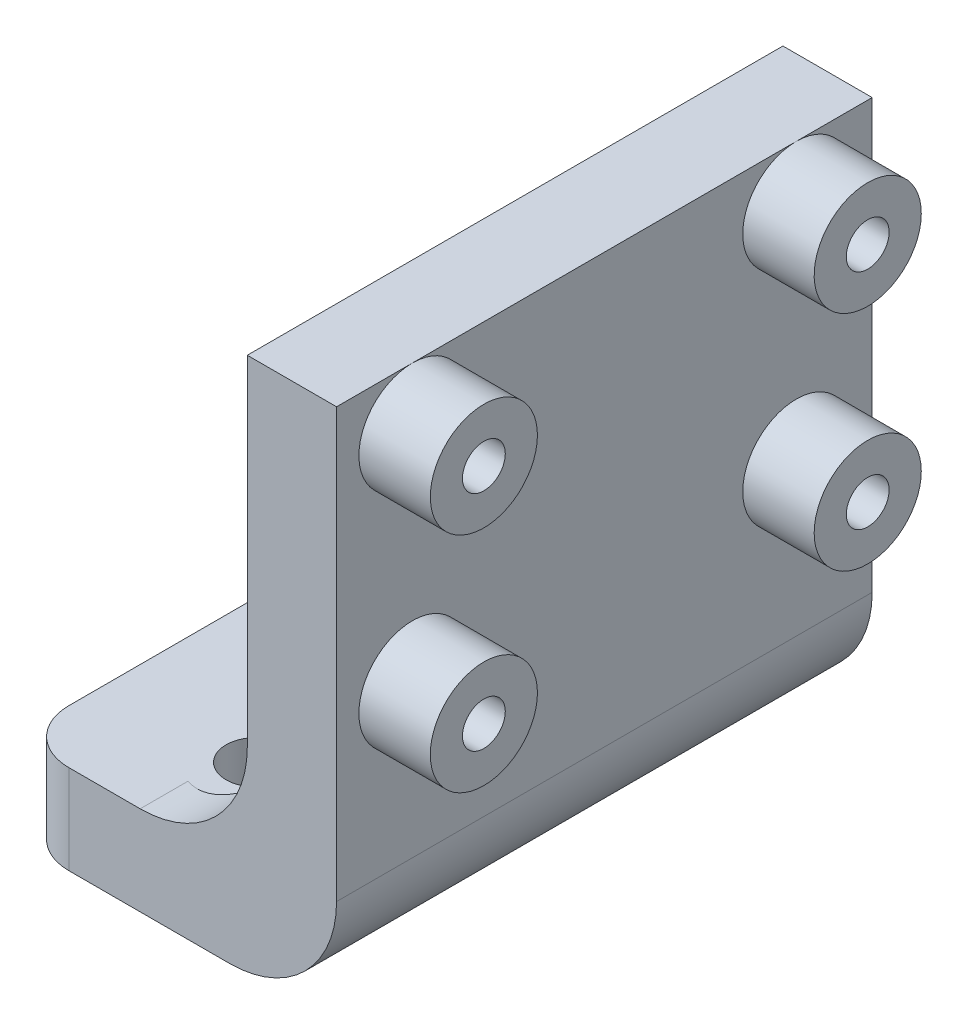
ISO-10303-21;
HEADER;
FILE_DESCRIPTION(('STEP AP214'),'2;1');
FILE_NAME('part.step','',(''),(''),'','','');
FILE_SCHEMA(('AUTOMOTIVE_DESIGN { 1 0 10303 214 1 1 1 1 }'));
ENDSEC;
DATA;
#1=APPLICATION_CONTEXT('core data for automotive mechanical design processes');
#2=APPLICATION_PROTOCOL_DEFINITION('international standard','automotive_design',2000,#1);
#3=PRODUCT_CONTEXT('',#1,'mechanical');
#4=PRODUCT('Part','Part','',(#3));
#5=PRODUCT_RELATED_PRODUCT_CATEGORY('part','',(#4));
#6=PRODUCT_DEFINITION_FORMATION('','',#4);
#7=PRODUCT_DEFINITION_CONTEXT('part definition',#1,'design');
#8=PRODUCT_DEFINITION('design','',#6,#7);
#9=PRODUCT_DEFINITION_SHAPE('','',#8);
#10=(LENGTH_UNIT() NAMED_UNIT(*) SI_UNIT(.MILLI.,.METRE.));
#11=(NAMED_UNIT(*) PLANE_ANGLE_UNIT() SI_UNIT($,.RADIAN.));
#12=(NAMED_UNIT(*) SI_UNIT($,.STERADIAN.) SOLID_ANGLE_UNIT());
#13=UNCERTAINTY_MEASURE_WITH_UNIT(LENGTH_MEASURE(1.E-05),#10,'distance_accuracy_value','');
#14=(GEOMETRIC_REPRESENTATION_CONTEXT(3) GLOBAL_UNCERTAINTY_ASSIGNED_CONTEXT((#13)) GLOBAL_UNIT_ASSIGNED_CONTEXT((#10,
#11,#12)) REPRESENTATION_CONTEXT('',''));
#15=CARTESIAN_POINT('',(0.,0.,0.));
#16=DIRECTION('',(0.,0.,1.));
#17=DIRECTION('',(1.,0.,0.));
#18=AXIS2_PLACEMENT_3D('',#15,#16,#17);
#19=CARTESIAN_POINT('',(7.,11.,0.));
#20=DIRECTION('',(0.,0.,-1.));
#21=DIRECTION('',(-1.,0.,0.));
#22=AXIS2_PLACEMENT_3D('',#19,#20,#21);
#23=CYLINDRICAL_SURFACE('',#22,6.);
#24=CARTESIAN_POINT('',(8.00000000000002,5.08392021690039,-28.5100714985278));
#25=CARTESIAN_POINT('',(7.84789751883135,5.0582090319891,-28.5100718905972));
#26=CARTESIAN_POINT('',(7.69478669028184,5.03841290223535,-28.4984583774313));
#27=CARTESIAN_POINT('',(7.39109321818378,5.010818719596,-28.4516411505789));
#28=CARTESIAN_POINT('',(7.24051068436831,5.00302118614912,-28.4164364156849));
#29=CARTESIAN_POINT('',(6.94662113330718,4.9984380002323,-28.3232790272564));
#30=CARTESIAN_POINT('',(6.80330544942507,5.00163890158644,-28.2653542269523));
#31=CARTESIAN_POINT('',(6.52765165009657,5.01702638052834,-28.1284476730564));
#32=CARTESIAN_POINT('',(6.39531651588847,5.02921538957966,-28.0494602252875));
#33=CARTESIAN_POINT('',(6.14157484736655,5.06031340202125,-27.8703658466389));
#34=CARTESIAN_POINT('',(6.02053405636214,5.07938618866492,-27.7697707517315));
#35=CARTESIAN_POINT('',(5.79589944101414,5.120951216748,-27.5512757937397));
#36=CARTESIAN_POINT('',(5.6923122060305,5.14344474357238,-27.4333694263107));
#37=CARTESIAN_POINT('',(5.49794879192282,5.19013258645659,-27.1737691895386));
#38=CARTESIAN_POINT('',(5.4086435980823,5.21433210681904,-27.0309710247807));
#39=CARTESIAN_POINT('',(5.25495778141584,5.25881037495424,-26.7319533641095));
#40=CARTESIAN_POINT('',(5.19057661223977,5.279089208666,-26.5757341624854));
#41=CARTESIAN_POINT('',(5.08862686331395,5.31233184985612,-26.2534105787782));
#42=CARTESIAN_POINT('',(5.05114665618848,5.32527151843515,-26.0872755403016));
#43=CARTESIAN_POINT('',(5.00484182259961,5.34138064893803,-25.7506247909624));
#44=CARTESIAN_POINT('',(4.99600444669539,5.34455445779034,-25.5801110632094));
#45=CARTESIAN_POINT('',(5.00702185375319,5.34066741066939,-25.2492791766949));
#46=CARTESIAN_POINT('',(5.02537249194092,5.33414303116793,-25.0889019929779));
#47=CARTESIAN_POINT('',(5.08734945130609,5.31292477909426,-24.7736758505269));
#48=CARTESIAN_POINT('',(5.13097943444225,5.29822972293261,-24.6188276961774));
#49=CARTESIAN_POINT('',(5.24232027935767,5.26293096284372,-24.3179899429784));
#50=CARTESIAN_POINT('',(5.31014095300742,5.24230039909582,-24.1720443540208));
#51=CARTESIAN_POINT('',(5.46797419439544,5.19831129596387,-23.8931166470157));
#52=CARTESIAN_POINT('',(5.55799442724695,5.17495181580273,-23.7601390287553));
#53=CARTESIAN_POINT('',(5.76359835659601,5.12777655893467,-23.5033325186111));
#54=CARTESIAN_POINT('',(5.88030325370111,5.10400468687349,-23.3803902889661));
#55=CARTESIAN_POINT('',(6.13328376796262,5.06154714335134,-23.1555012022659));
#56=CARTESIAN_POINT('',(6.26955830164238,5.0428611904732,-23.0535531836223));
#57=CARTESIAN_POINT('',(6.55672864211378,5.01467674324886,-22.8746797145725));
#58=CARTESIAN_POINT('',(6.70747012003499,5.00509105208329,-22.7975215641654));
#59=CARTESIAN_POINT('',(7.02001396713849,4.99800371360368,-22.6696338153028));
#60=CARTESIAN_POINT('',(7.18180892005238,5.00049404094881,-22.6188866897412));
#61=CARTESIAN_POINT('',(7.4986470350424,5.01880796232367,-22.5481412922416));
#62=CARTESIAN_POINT('',(7.65330554464378,5.03363261688468,-22.5261478023029));
#63=CARTESIAN_POINT('',(7.96246543819703,5.07564477542519,-22.5063104948437));
#64=CARTESIAN_POINT('',(8.1169668319394,5.1028314548921,-22.5084650669414));
#65=CARTESIAN_POINT('',(8.4180947427373,5.16799668978171,-22.5355823302101));
#66=CARTESIAN_POINT('',(8.56481875026833,5.20573439901383,-22.5600608283495));
#67=CARTESIAN_POINT('',(8.85049608936739,5.29054339647473,-22.6293974820097));
#68=CARTESIAN_POINT('',(8.98944769828473,5.33761674339956,-22.6742601354694));
#69=CARTESIAN_POINT('',(9.26869878913494,5.44327722875373,-22.7870223344731));
#70=CARTESIAN_POINT('',(9.4080849777656,5.50250662943537,-22.856572283433));
#71=CARTESIAN_POINT('',(9.67287558726987,5.62625425950321,-23.0150095501323));
#72=CARTESIAN_POINT('',(9.79826743781556,5.69077715491286,-23.1039140448409));
#73=CARTESIAN_POINT('',(10.0499147727355,5.83071591538383,-23.3127575212907));
#74=CARTESIAN_POINT('',(10.1738731439714,5.90640040284554,-23.4352915406591));
#75=CARTESIAN_POINT('',(10.3996776472082,6.05425549512645,-23.7012148664911));
#76=CARTESIAN_POINT('',(10.5015261917709,6.12642648266147,-23.8446018946791));
#77=CARTESIAN_POINT('',(10.6631941942347,6.24719201144914,-24.1215587351886));
#78=CARTESIAN_POINT('',(10.7273245709457,6.2976581659982,-24.2517883733249));
#79=CARTESIAN_POINT('',(10.8369542441046,6.38667299424251,-24.5236271236072));
#80=CARTESIAN_POINT('',(10.88248706868,6.42524308343137,-24.6652152019735));
#81=CARTESIAN_POINT('',(10.9470009130155,6.48084897615273,-24.9345027153276));
#82=CARTESIAN_POINT('',(10.9689953033555,6.5002896056914,-25.0609729892381));
#83=CARTESIAN_POINT('',(10.9965453595324,6.52473619305721,-25.3170449017964));
#84=CARTESIAN_POINT('',(11.0021140281965,6.52975356845063,-25.4466439816513));
#85=CARTESIAN_POINT('',(10.9964403595016,6.52468173703199,-25.7052004271848));
#86=CARTESIAN_POINT('',(10.9851929579425,6.51458797946458,-25.8341575878121));
#87=CARTESIAN_POINT('',(10.9466440770006,6.48063766484156,-26.0878221345364));
#88=CARTESIAN_POINT('',(10.9193249506222,6.45676597996047,-26.2125246895265));
#89=CARTESIAN_POINT('',(10.8413630375012,6.39053808606457,-26.4855584185128));
#90=CARTESIAN_POINT('',(10.7865795709987,6.3450410814341,-26.6319331290956));
#91=CARTESIAN_POINT('',(10.657149869379,6.24268544349807,-26.9112655548037));
#92=CARTESIAN_POINT('',(10.5824770782626,6.18581164549419,-27.0442050015274));
#93=CARTESIAN_POINT('',(10.4142179546171,6.06502113584838,-27.2975407235344));
#94=CARTESIAN_POINT('',(10.320338678796,6.00100332347775,-27.4176926080188));
#95=CARTESIAN_POINT('',(10.1161227293644,5.87121485857937,-27.6419813245769));
#96=CARTESIAN_POINT('',(10.0057813494506,5.80544370922598,-27.7461135594911));
#97=CARTESIAN_POINT('',(9.74667985326442,5.66318036839258,-27.955901081222));
#98=CARTESIAN_POINT('',(9.59463100724248,5.58712113453784,-28.057834684635));
#99=CARTESIAN_POINT('',(9.27131846231304,5.44371591313926,-28.2335827090987));
#100=CARTESIAN_POINT('',(9.10006810367525,5.37636394539931,-28.3074164977263));
#101=CARTESIAN_POINT('',(8.7754129689379,5.26661901894525,-28.4121795980406));
#102=CARTESIAN_POINT('',(8.6245305388454,5.2219138419297,-28.4485064269848));
#103=CARTESIAN_POINT('',(8.31612682654759,5.14397534596778,-28.497441478707));
#104=CARTESIAN_POINT('',(8.15861166223169,5.11073170442769,-28.5100710896798));
#105=CARTESIAN_POINT('',(8.00000000000002,5.08392021690039,-28.5100714985278));
#106=B_SPLINE_CURVE_WITH_KNOTS('',3,(#24,#25,#26,#27,#28,#29,#30,#31,#32,#33,#34,#35,#36,#37,
#38,#39,#40,#41,#42,#43,#44,#45,#46,#47,#48,#49,#50,#51,#52,#53,#54,#55,#56,#57,#58,#59,#60,#61,
#62,#63,#64,#65,#66,#67,#68,#69,#70,#71,#72,#73,#74,#75,#76,#77,#78,#79,#80,#81,#82,#83,#84,#85,
#86,#87,#88,#89,#90,#91,#92,#93,#94,#95,#96,#97,#98,#99,#100,#101,#102,#103,#104,#105),
.UNSPECIFIED.,.T.,.F.,(4,2,2,2,2,2,2,2,2,2,2,2,2,2,2,2,2,2,2,2,2,2,2,2,2,2,2,2,2,2,2,2,2,2,2,2,
2,2,2,2,4),(0.,0.462216772276608,0.924453554105707,1.38612542786928,1.84792223898085,
2.32152132255117,2.79529880850828,3.30338605339703,3.81146216006648,4.32119980685944,
4.83071052904856,5.3130650876817,5.79548953753474,6.2801323868527,6.76494280960626,
7.2760332675764,7.78709543982784,8.2932097693966,8.79898779746674,9.26738842836665,
9.73575782283287,10.1942040743756,10.652751535185,11.1507650580638,11.6492223780737,
12.2168840199377,12.784483688999,13.243869500551,13.7024234250507,14.0902043220262,
14.477678163818,14.8652687177982,15.2532856484527,15.7390013161089,16.225368785285,
16.7197967965541,17.2143664302404,17.8061212966767,18.3974675588638,18.8799003974332,
19.3618976008901),.UNSPECIFIED.);
#107=CARTESIAN_POINT('',(6.99999999999999,5.,-22.6816443737816));
#108=VERTEX_POINT('',#107);
#109=CARTESIAN_POINT('',(6.99999999999999,5.,-28.338498623274));
#110=VERTEX_POINT('',#109);
#111=EDGE_CURVE('E151',#108,#110,#106,.T.);
#112=ORIENTED_EDGE('',*,*,#111,.F.);
#113=DIRECTION('',(0.,0.,-1.));
#114=VECTOR('',#113,1.);
#115=CARTESIAN_POINT('',(7.,5.,0.));
#116=LINE('',#115,#114);
#117=CARTESIAN_POINT('',(7.,5.,-8.33849862327395));
#118=VERTEX_POINT('',#117);
#119=EDGE_CURVE('E159',#118,#108,#116,.T.);
#120=ORIENTED_EDGE('',*,*,#119,.F.);
#121=CARTESIAN_POINT('',(8.00000000000004,5.08392021690039,-8.51007149852777));
#122=CARTESIAN_POINT('',(7.84789751883137,5.0582090319891,-8.51007189059724));
#123=CARTESIAN_POINT('',(7.69478669028186,5.03841290223536,-8.49845837743126));
#124=CARTESIAN_POINT('',(7.39109321818379,5.010818719596,-8.45164115057889));
#125=CARTESIAN_POINT('',(7.24051068436833,5.00302118614912,-8.41643641568487));
#126=CARTESIAN_POINT('',(6.94662113330719,4.9984380002323,-8.32327902725642));
#127=CARTESIAN_POINT('',(6.80330544942508,5.00163890158644,-8.26535422695225));
#128=CARTESIAN_POINT('',(6.52765165009659,5.01702638052834,-8.12844767305636));
#129=CARTESIAN_POINT('',(6.39531651588848,5.02921538957966,-8.04946022528747));
#130=CARTESIAN_POINT('',(6.14157484736656,5.06031340202125,-7.87036584663891));
#131=CARTESIAN_POINT('',(6.02053405636215,5.07938618866492,-7.76977075173145));
#132=CARTESIAN_POINT('',(5.79589944101416,5.120951216748,-7.55127579373965));
#133=CARTESIAN_POINT('',(5.69231220603051,5.14344474357238,-7.43336942631073));
#134=CARTESIAN_POINT('',(5.49794879192283,5.19013258645658,-7.17376918953857));
#135=CARTESIAN_POINT('',(5.40864359808231,5.21433210681904,-7.03097102478068));
#136=CARTESIAN_POINT('',(5.25495778141585,5.25881037495424,-6.73195336410947));
#137=CARTESIAN_POINT('',(5.19057661223979,5.279089208666,-6.57573416248538));
#138=CARTESIAN_POINT('',(5.08862686331396,5.31233184985611,-6.25341057877823));
#139=CARTESIAN_POINT('',(5.05114665618849,5.32527151843515,-6.08727554030163));
#140=CARTESIAN_POINT('',(5.00484182259962,5.34138064893803,-5.75062479096235));
#141=CARTESIAN_POINT('',(4.9960044466954,5.34455445779033,-5.58011106320936));
#142=CARTESIAN_POINT('',(5.00702185375321,5.34066741066938,-5.24927917669486));
#143=CARTESIAN_POINT('',(5.02537249194093,5.33414303116792,-5.08890199297787));
#144=CARTESIAN_POINT('',(5.0873494513061,5.31292477909426,-4.7736758505269));
#145=CARTESIAN_POINT('',(5.13097943444227,5.29822972293261,-4.61882769617738));
#146=CARTESIAN_POINT('',(5.24232027935769,5.26293096284372,-4.3179899429784));
#147=CARTESIAN_POINT('',(5.31014095300743,5.24230039909582,-4.17204435402083));
#148=CARTESIAN_POINT('',(5.46797419439546,5.19831129596387,-3.8931166470157));
#149=CARTESIAN_POINT('',(5.55799442724697,5.17495181580272,-3.76013902875524));
#150=CARTESIAN_POINT('',(5.76359835659603,5.12777655893467,-3.50333251861106));
#151=CARTESIAN_POINT('',(5.88030325370113,5.10400468687349,-3.3803902889661));
#152=CARTESIAN_POINT('',(6.13328376796264,5.06154714335134,-3.15550120226593));
#153=CARTESIAN_POINT('',(6.2695583016424,5.0428611904732,-3.05355318362233));
#154=CARTESIAN_POINT('',(6.55672864211379,5.01467674324886,-2.87467971457246));
#155=CARTESIAN_POINT('',(6.707470120035,5.00509105208329,-2.7975215641654));
#156=CARTESIAN_POINT('',(7.0200139671385,4.99800371360368,-2.66963381530275));
#157=CARTESIAN_POINT('',(7.1818089200524,5.00049404094881,-2.61888668974117));
#158=CARTESIAN_POINT('',(7.49864703504242,5.01880796232367,-2.54814129224155));
#159=CARTESIAN_POINT('',(7.6533055446438,5.03363261688468,-2.5261478023029));
#160=CARTESIAN_POINT('',(7.96246543819704,5.07564477542519,-2.50631049484368));
#161=CARTESIAN_POINT('',(8.11696683193941,5.10283145489211,-2.50846506694137));
#162=CARTESIAN_POINT('',(8.41809474273732,5.16799668978171,-2.53558233021011));
#163=CARTESIAN_POINT('',(8.56481875026835,5.20573439901384,-2.56006082834954));
#164=CARTESIAN_POINT('',(8.85049608936741,5.29054339647474,-2.62939748200974));
#165=CARTESIAN_POINT('',(8.98944769828475,5.33761674339957,-2.67426013546944));
#166=CARTESIAN_POINT('',(9.26869878913496,5.44327722875373,-2.78702233447305));
#167=CARTESIAN_POINT('',(9.40808497776562,5.50250662943538,-2.85657228343301));
#168=CARTESIAN_POINT('',(9.67287558726989,5.62625425950321,-3.01500955013231));
#169=CARTESIAN_POINT('',(9.79826743781558,5.69077715491287,-3.1039140448409));
#170=CARTESIAN_POINT('',(10.0499147727355,5.83071591538383,-3.31275752129071));
#171=CARTESIAN_POINT('',(10.1738731439714,5.90640040284555,-3.43529154065911));
#172=CARTESIAN_POINT('',(10.3996776472082,6.05425549512645,-3.70121486649106));
#173=CARTESIAN_POINT('',(10.501526191771,6.12642648266148,-3.84460189467909));
#174=CARTESIAN_POINT('',(10.6631941942347,6.24719201144915,-4.12155873518855));
#175=CARTESIAN_POINT('',(10.7273245709457,6.29765816599821,-4.2517883733249));
#176=CARTESIAN_POINT('',(10.8369542441047,6.38667299424253,-4.52362712360718));
#177=CARTESIAN_POINT('',(10.88248706868,6.42524308343138,-4.66521520197349));
#178=CARTESIAN_POINT('',(10.9470009130155,6.48084897615274,-4.93450271532765));
#179=CARTESIAN_POINT('',(10.9689953033555,6.50028960569141,-5.06097298923808));
#180=CARTESIAN_POINT('',(10.9965453595324,6.52473619305722,-5.31704490179642));
#181=CARTESIAN_POINT('',(11.0021140281965,6.52975356845064,-5.44664398165132));
#182=CARTESIAN_POINT('',(10.9964403595016,6.524681737032,-5.70520042718476));
#183=CARTESIAN_POINT('',(10.9851929579425,6.51458797946459,-5.83415758781215));
#184=CARTESIAN_POINT('',(10.9466440770006,6.48063766484157,-6.08782213453639));
#185=CARTESIAN_POINT('',(10.9193249506223,6.45676597996048,-6.21252468952653));
#186=CARTESIAN_POINT('',(10.8413630375012,6.39053808606457,-6.48555841851276));
#187=CARTESIAN_POINT('',(10.7865795709987,6.34504108143411,-6.6319331290956));
#188=CARTESIAN_POINT('',(10.657149869379,6.24268544349808,-6.91126555480372));
#189=CARTESIAN_POINT('',(10.5824770782627,6.18581164549419,-7.04420500152737));
#190=CARTESIAN_POINT('',(10.4142179546171,6.06502113584838,-7.29754072353443));
#191=CARTESIAN_POINT('',(10.320338678796,6.00100332347775,-7.41769260801878));
#192=CARTESIAN_POINT('',(10.1161227293644,5.87121485857937,-7.64198132457693));
#193=CARTESIAN_POINT('',(10.0057813494506,5.80544370922598,-7.74611355949108));
#194=CARTESIAN_POINT('',(9.74667985326442,5.66318036839258,-7.95590108122199));
#195=CARTESIAN_POINT('',(9.59463100724249,5.58712113453784,-8.05783468463498));
#196=CARTESIAN_POINT('',(9.27131846231304,5.44371591313925,-8.23358270909868));
#197=CARTESIAN_POINT('',(9.10006810367526,5.37636394539931,-8.30741649772632));
#198=CARTESIAN_POINT('',(8.77541296893791,5.26661901894525,-8.41217959804061));
#199=CARTESIAN_POINT('',(8.62453053884541,5.2219138419297,-8.44850642698478));
#200=CARTESIAN_POINT('',(8.3161268265476,5.14397534596778,-8.49744147870698));
#201=CARTESIAN_POINT('',(8.1586116622317,5.11073170442769,-8.51007108967981));
#202=CARTESIAN_POINT('',(8.00000000000004,5.08392021690039,-8.51007149852777));
#203=B_SPLINE_CURVE_WITH_KNOTS('',3,(#121,#122,#123,#124,#125,#126,#127,#128,#129,#130,#131,
#132,#133,#134,#135,#136,#137,#138,#139,#140,#141,#142,#143,#144,#145,#146,#147,#148,#149,#150,
#151,#152,#153,#154,#155,#156,#157,#158,#159,#160,#161,#162,#163,#164,#165,#166,#167,#168,#169,
#170,#171,#172,#173,#174,#175,#176,#177,#178,#179,#180,#181,#182,#183,#184,#185,#186,#187,#188,
#189,#190,#191,#192,#193,#194,#195,#196,#197,#198,#199,#200,#201,#202),.UNSPECIFIED.,.T.,.F.,(4,
2,2,2,2,2,2,2,2,2,2,2,2,2,2,2,2,2,2,2,2,2,2,2,2,2,2,2,2,2,2,2,2,2,2,2,2,2,2,2,4),(0.,
0.462216772276608,0.924453554105709,1.38612542786929,1.84792223898085,2.32152132255117,
2.79529880850828,3.30338605339703,3.81146216006649,4.32119980685945,4.83071052904856,
5.31306508768171,5.79548953753475,6.28013238685271,6.76494280960627,7.27603326757641,
7.78709543982784,8.29320976939661,8.79898779746675,9.26738842836666,9.73575782283288,
10.1942040743756,10.652751535185,11.1507650580638,11.6492223780738,12.2168840199377,
12.784483688999,13.243869500551,13.7024234250507,14.0902043220263,14.477678163818,
14.8652687177983,15.2532856484527,15.7390013161089,16.225368785285,16.7197967965541,
17.2143664302404,17.8061212966767,18.3974675588638,18.8799003974332,19.3618976008901),.UNSPECIFIED.);
#204=CARTESIAN_POINT('',(7.,5.,-2.68164437378159));
#205=VERTEX_POINT('',#204);
#206=EDGE_CURVE('E142',#205,#118,#203,.T.);
#207=ORIENTED_EDGE('',*,*,#206,.F.);
#208=CARTESIAN_POINT('',(7.,5.,0.));
#209=VERTEX_POINT('',#208);
#210=EDGE_CURVE('E160',#209,#205,#116,.T.);
#211=ORIENTED_EDGE('',*,*,#210,.F.);
#212=CARTESIAN_POINT('',(7.,11.,0.));
#213=DIRECTION('',(0.,0.,-1.));
#214=DIRECTION('',(-1.,0.,0.));
#215=AXIS2_PLACEMENT_3D('',#212,#213,#214);
#216=CIRCLE('',#215,6.);
#217=CARTESIAN_POINT('',(13.,11.,0.));
#218=VERTEX_POINT('',#217);
#219=EDGE_CURVE('E181',#218,#209,#216,.T.);
#220=ORIENTED_EDGE('',*,*,#219,.F.);
#221=DIRECTION('',(0.,0.,-1.));
#222=VECTOR('',#221,1.);
#223=CARTESIAN_POINT('',(13.,11.,0.));
#224=LINE('',#223,#222);
#225=CARTESIAN_POINT('',(13.,11.,-30.));
#226=VERTEX_POINT('',#225);
#227=EDGE_CURVE('E171',#226,#218,#224,.F.);
#228=ORIENTED_EDGE('',*,*,#227,.F.);
#229=CARTESIAN_POINT('',(6.99999999999999,11.,-30.));
#230=DIRECTION('',(0.,0.,1.));
#231=DIRECTION('',(1.,0.,0.));
#232=AXIS2_PLACEMENT_3D('',#229,#230,#231);
#233=CIRCLE('',#232,6.);
#234=CARTESIAN_POINT('',(6.99999999999999,5.,-30.));
#235=VERTEX_POINT('',#234);
#236=EDGE_CURVE('E178',#235,#226,#233,.T.);
#237=ORIENTED_EDGE('',*,*,#236,.F.);
#238=EDGE_CURVE('E167',#110,#235,#116,.T.);
#239=ORIENTED_EDGE('',*,*,#238,.F.);
#240=EDGE_LOOP('',(#112,#120,#207,#211,#220,#228,#237,#239));
#241=FACE_BOUND('',#240,.T.);
#242=ADVANCED_FACE('F45',(#241),#23,.F.);
#243=CARTESIAN_POINT('',(8.00000000000002,24.,-25.5100714985278));
#244=DIRECTION('',(0.,-1.,0.));
#245=DIRECTION('',(0.,0.,-1.));
#246=AXIS2_PLACEMENT_3D('',#243,#244,#245);
#247=CYLINDRICAL_SURFACE('',#246,1.7);
#248=CARTESIAN_POINT('',(8.00000000000002,0.,-25.5100714985278));
#249=DIRECTION('',(0.,-1.,0.));
#250=DIRECTION('',(0.,0.,-1.));
#251=AXIS2_PLACEMENT_3D('',#248,#249,#250);
#252=CIRCLE('',#251,1.7);
#253=CARTESIAN_POINT('',(8.00000000000002,0.,-27.2100714985278));
#254=VERTEX_POINT('',#253);
#255=EDGE_CURVE('E400',#254,#254,#252,.T.);
#256=ORIENTED_EDGE('',*,*,#255,.T.);
#257=EDGE_LOOP('',(#256));
#258=FACE_BOUND('',#257,.T.);
#259=CARTESIAN_POINT('',(8.00000000000002,5.,-25.5100714985278));
#260=DIRECTION('',(0.,-1.,0.));
#261=DIRECTION('',(0.,0.,-1.));
#262=AXIS2_PLACEMENT_3D('',#259,#260,#261);
#263=CIRCLE('',#262,1.7);
#264=CARTESIAN_POINT('',(8.00000000000002,5.,-27.2100714985278));
#265=VERTEX_POINT('',#264);
#266=EDGE_CURVE('E537',#265,#265,#263,.T.);
#267=ORIENTED_EDGE('',*,*,#266,.F.);
#268=EDGE_LOOP('',(#267));
#269=FACE_BOUND('',#268,.T.);
#270=ADVANCED_FACE('F214',(#258,#269),#247,.F.);
#271=CARTESIAN_POINT('',(8.00000000000004,24.,-5.51007149852777));
#272=DIRECTION('',(0.,-1.,0.));
#273=DIRECTION('',(0.,0.,-1.));
#274=AXIS2_PLACEMENT_3D('',#271,#272,#273);
#275=CYLINDRICAL_SURFACE('',#274,1.7);
#276=CARTESIAN_POINT('',(8.00000000000004,0.,-5.51007149852777));
#277=DIRECTION('',(0.,-1.,0.));
#278=DIRECTION('',(0.,0.,-1.));
#279=AXIS2_PLACEMENT_3D('',#276,#277,#278);
#280=CIRCLE('',#279,1.7);
#281=CARTESIAN_POINT('',(8.00000000000004,0.,-7.21007149852777));
#282=VERTEX_POINT('',#281);
#283=EDGE_CURVE('E541',#282,#282,#280,.T.);
#284=ORIENTED_EDGE('',*,*,#283,.T.);
#285=EDGE_LOOP('',(#284));
#286=FACE_BOUND('',#285,.T.);
#287=CARTESIAN_POINT('',(8.00000000000004,5.,-5.51007149852777));
#288=DIRECTION('',(0.,-1.,0.));
#289=DIRECTION('',(0.,0.,-1.));
#290=AXIS2_PLACEMENT_3D('',#287,#288,#289);
#291=CIRCLE('',#290,1.7);
#292=CARTESIAN_POINT('',(8.00000000000004,5.,-7.21007149852777));
#293=VERTEX_POINT('',#292);
#294=EDGE_CURVE('E533',#293,#293,#291,.T.);
#295=ORIENTED_EDGE('',*,*,#294,.F.);
#296=EDGE_LOOP('',(#295));
#297=FACE_BOUND('',#296,.T.);
#298=ADVANCED_FACE('F210',(#286,#297),#275,.F.);
#299=CARTESIAN_POINT('',(18.,5.,0.));
#300=DIRECTION('',(-1.,0.,0.));
#301=DIRECTION('',(0.,0.,1.));
#302=AXIS2_PLACEMENT_3D('',#299,#300,#301);
#303=PLANE('',#302);
#304=CARTESIAN_POINT('',(18.,14.5,-4.25));
#305=DIRECTION('',(-1.,0.,0.));
#306=DIRECTION('',(0.,0.,1.));
#307=AXIS2_PLACEMENT_3D('',#304,#305,#306);
#308=CIRCLE('',#307,3.);
#309=CARTESIAN_POINT('',(18.,14.5,-1.25));
#310=VERTEX_POINT('',#309);
#311=EDGE_CURVE('E152',#310,#310,#308,.F.);
#312=ORIENTED_EDGE('',*,*,#311,.F.);
#313=EDGE_LOOP('',(#312));
#314=FACE_BOUND('',#313,.T.);
#315=CARTESIAN_POINT('',(18.,14.5,-25.75));
#316=DIRECTION('',(-1.,0.,0.));
#317=DIRECTION('',(0.,0.,1.));
#318=AXIS2_PLACEMENT_3D('',#315,#316,#317);
#319=CIRCLE('',#318,3.);
#320=CARTESIAN_POINT('',(18.,14.5,-22.75));
#321=VERTEX_POINT('',#320);
#322=EDGE_CURVE('E185',#321,#321,#319,.F.);
#323=ORIENTED_EDGE('',*,*,#322,.F.);
#324=EDGE_LOOP('',(#323));
#325=FACE_BOUND('',#324,.T.);
#326=DIRECTION('',(0.,0.,1.));
#327=VECTOR('',#326,1.);
#328=CARTESIAN_POINT('',(18.,30.,0.));
#329=LINE('',#328,#327);
#330=CARTESIAN_POINT('',(18.,30.,-30.));
#331=VERTEX_POINT('',#330);
#332=CARTESIAN_POINT('',(18.,30.,-25.75));
#333=VERTEX_POINT('',#332);
#334=EDGE_CURVE('E463',#331,#333,#329,.T.);
#335=ORIENTED_EDGE('',*,*,#334,.T.);
#336=CARTESIAN_POINT('',(18.,27.,-25.75));
#337=DIRECTION('',(1.,0.,0.));
#338=DIRECTION('',(0.,0.,-1.));
#339=AXIS2_PLACEMENT_3D('',#336,#337,#338);
#340=CIRCLE('',#339,3.);
#341=EDGE_CURVE('E519',#333,#333,#340,.T.);
#342=ORIENTED_EDGE('',*,*,#341,.F.);
#343=CARTESIAN_POINT('',(18.,30.,-4.25));
#344=VERTEX_POINT('',#343);
#345=EDGE_CURVE('E467',#333,#344,#329,.T.);
#346=ORIENTED_EDGE('',*,*,#345,.T.);
#347=CARTESIAN_POINT('',(18.,27.,-4.25));
#348=DIRECTION('',(1.,0.,0.));
#349=DIRECTION('',(0.,0.,-1.));
#350=AXIS2_PLACEMENT_3D('',#347,#348,#349);
#351=CIRCLE('',#350,3.);
#352=EDGE_CURVE('E494',#344,#344,#351,.T.);
#353=ORIENTED_EDGE('',*,*,#352,.F.);
#354=CARTESIAN_POINT('',(18.,30.,0.));
#355=VERTEX_POINT('',#354);
#356=EDGE_CURVE('E451',#344,#355,#329,.T.);
#357=ORIENTED_EDGE('',*,*,#356,.T.);
#358=DIRECTION('',(0.,-1.,0.));
#359=VECTOR('',#358,1.);
#360=CARTESIAN_POINT('',(18.,5.,0.));
#361=LINE('',#360,#359);
#362=CARTESIAN_POINT('',(18.,6.,0.));
#363=VERTEX_POINT('',#362);
#364=EDGE_CURVE('E413',#355,#363,#361,.T.);
#365=ORIENTED_EDGE('',*,*,#364,.T.);
#366=DIRECTION('',(0.,0.,-1.));
#367=VECTOR('',#366,1.);
#368=CARTESIAN_POINT('',(18.,6.,-30.));
#369=LINE('',#368,#367);
#370=CARTESIAN_POINT('',(18.,6.,-30.));
#371=VERTEX_POINT('',#370);
#372=EDGE_CURVE('E432',#363,#371,#369,.T.);
#373=ORIENTED_EDGE('',*,*,#372,.T.);
#374=DIRECTION('',(0.,-1.,0.));
#375=VECTOR('',#374,1.);
#376=CARTESIAN_POINT('',(18.,5.,-30.));
#377=LINE('',#376,#375);
#378=EDGE_CURVE('E407',#331,#371,#377,.T.);
#379=ORIENTED_EDGE('',*,*,#378,.F.);
#380=EDGE_LOOP('',(#335,#342,#346,#353,#357,#365,#373,#379));
#381=FACE_BOUND('',#380,.T.);
#382=ADVANCED_FACE('F213',(#314,#325,#381),#303,.F.);
#383=CARTESIAN_POINT('',(0.,5.,0.));
#384=DIRECTION('',(1.,0.,0.));
#385=DIRECTION('',(0.,0.,-1.));
#386=AXIS2_PLACEMENT_3D('',#383,#384,#385);
#387=PLANE('',#386);
#388=DIRECTION('',(0.,0.,1.));
#389=VECTOR('',#388,1.);
#390=CARTESIAN_POINT('',(0.,0.,0.));
#391=LINE('',#390,#389);
#392=CARTESIAN_POINT('',(0.,0.,-27.));
#393=VERTEX_POINT('',#392);
#394=CARTESIAN_POINT('',(0.,0.,-3.));
#395=VERTEX_POINT('',#394);
#396=EDGE_CURVE('E419',#393,#395,#391,.T.);
#397=ORIENTED_EDGE('',*,*,#396,.T.);
#398=DIRECTION('',(0.,-1.,0.));
#399=VECTOR('',#398,1.);
#400=CARTESIAN_POINT('',(0.,5.,-3.));
#401=LINE('',#400,#399);
#402=CARTESIAN_POINT('',(0.,5.,-3.));
#403=VERTEX_POINT('',#402);
#404=EDGE_CURVE('E67',#395,#403,#401,.F.);
#405=ORIENTED_EDGE('',*,*,#404,.T.);
#406=DIRECTION('',(0.,0.,1.));
#407=VECTOR('',#406,1.);
#408=CARTESIAN_POINT('',(0.,5.,0.));
#409=LINE('',#408,#407);
#410=CARTESIAN_POINT('',(0.,5.,-27.));
#411=VERTEX_POINT('',#410);
#412=EDGE_CURVE('E415',#411,#403,#409,.T.);
#413=ORIENTED_EDGE('',*,*,#412,.F.);
#414=DIRECTION('',(0.,-1.,0.));
#415=VECTOR('',#414,1.);
#416=CARTESIAN_POINT('',(0.,5.,-27.));
#417=LINE('',#416,#415);
#418=EDGE_CURVE('E377',#411,#393,#417,.T.);
#419=ORIENTED_EDGE('',*,*,#418,.T.);
#420=EDGE_LOOP('',(#397,#405,#413,#419));
#421=FACE_BOUND('',#420,.T.);
#422=ADVANCED_FACE('F287',(#421),#387,.F.);
#423=CARTESIAN_POINT('',(0.,5.,0.));
#424=DIRECTION('',(0.,0.,-1.));
#425=DIRECTION('',(-1.,0.,0.));
#426=AXIS2_PLACEMENT_3D('',#423,#424,#425);
#427=PLANE('',#426);
#428=DIRECTION('',(1.,0.,0.));
#429=VECTOR('',#428,1.);
#430=CARTESIAN_POINT('',(0.,5.,0.));
#431=LINE('',#430,#429);
#432=CARTESIAN_POINT('',(3.,5.,0.));
#433=VERTEX_POINT('',#432);
#434=EDGE_CURVE('E408',#433,#209,#431,.T.);
#435=ORIENTED_EDGE('',*,*,#434,.F.);
#436=DIRECTION('',(0.,-1.,0.));
#437=VECTOR('',#436,1.);
#438=CARTESIAN_POINT('',(3.,5.,0.));
#439=LINE('',#438,#437);
#440=CARTESIAN_POINT('',(3.,0.,0.));
#441=VERTEX_POINT('',#440);
#442=EDGE_CURVE('E391',#433,#441,#439,.T.);
#443=ORIENTED_EDGE('',*,*,#442,.T.);
#444=DIRECTION('',(1.,0.,0.));
#445=VECTOR('',#444,1.);
#446=CARTESIAN_POINT('',(0.,0.,0.));
#447=LINE('',#446,#445);
#448=CARTESIAN_POINT('',(12.,0.,0.));
#449=VERTEX_POINT('',#448);
#450=EDGE_CURVE('E422',#441,#449,#447,.T.);
#451=ORIENTED_EDGE('',*,*,#450,.T.);
#452=CARTESIAN_POINT('',(12.,6.,0.));
#453=DIRECTION('',(0.,0.,-1.));
#454=DIRECTION('',(-1.,0.,0.));
#455=AXIS2_PLACEMENT_3D('',#452,#453,#454);
#456=CIRCLE('',#455,6.);
#457=EDGE_CURVE('E172',#449,#363,#456,.F.);
#458=ORIENTED_EDGE('',*,*,#457,.T.);
#459=ORIENTED_EDGE('',*,*,#364,.F.);
#460=DIRECTION('',(1.,0.,0.));
#461=VECTOR('',#460,1.);
#462=CARTESIAN_POINT('',(13.,30.,0.));
#463=LINE('',#462,#461);
#464=CARTESIAN_POINT('',(13.,30.,0.));
#465=VERTEX_POINT('',#464);
#466=EDGE_CURVE('E423',#465,#355,#463,.T.);
#467=ORIENTED_EDGE('',*,*,#466,.F.);
#468=DIRECTION('',(0.,-1.,0.));
#469=VECTOR('',#468,1.);
#470=CARTESIAN_POINT('',(13.,0.,0.));
#471=LINE('',#470,#469);
#472=EDGE_CURVE('E466',#465,#218,#471,.T.);
#473=ORIENTED_EDGE('',*,*,#472,.T.);
#474=ORIENTED_EDGE('',*,*,#219,.T.);
#475=EDGE_LOOP('',(#435,#443,#451,#458,#459,#467,#473,#474));
#476=FACE_BOUND('',#475,.T.);
#477=ADVANCED_FACE('F284',(#476),#427,.F.);
#478=CARTESIAN_POINT('',(0.,5.,-30.));
#479=DIRECTION('',(0.,0.,1.));
#480=DIRECTION('',(1.,0.,0.));
#481=AXIS2_PLACEMENT_3D('',#478,#479,#480);
#482=PLANE('',#481);
#483=DIRECTION('',(-1.,0.,0.));
#484=VECTOR('',#483,1.);
#485=CARTESIAN_POINT('',(0.,0.,-30.));
#486=LINE('',#485,#484);
#487=CARTESIAN_POINT('',(12.,0.,-30.));
#488=VERTEX_POINT('',#487);
#489=CARTESIAN_POINT('',(3.,0.,-30.));
#490=VERTEX_POINT('',#489);
#491=EDGE_CURVE('E426',#488,#490,#486,.T.);
#492=ORIENTED_EDGE('',*,*,#491,.T.);
#493=DIRECTION('',(0.,-1.,0.));
#494=VECTOR('',#493,1.);
#495=CARTESIAN_POINT('',(3.,5.,-30.));
#496=LINE('',#495,#494);
#497=CARTESIAN_POINT('',(3.,5.,-30.));
#498=VERTEX_POINT('',#497);
#499=EDGE_CURVE('E11',#490,#498,#496,.F.);
#500=ORIENTED_EDGE('',*,*,#499,.T.);
#501=DIRECTION('',(-1.,0.,0.));
#502=VECTOR('',#501,1.);
#503=CARTESIAN_POINT('',(0.,5.,-30.));
#504=LINE('',#503,#502);
#505=EDGE_CURVE('E405',#235,#498,#504,.T.);
#506=ORIENTED_EDGE('',*,*,#505,.F.);
#507=ORIENTED_EDGE('',*,*,#236,.T.);
#508=DIRECTION('',(0.,1.,0.));
#509=VECTOR('',#508,1.);
#510=CARTESIAN_POINT('',(13.,0.,-30.));
#511=LINE('',#510,#509);
#512=CARTESIAN_POINT('',(13.,30.,-30.));
#513=VERTEX_POINT('',#512);
#514=EDGE_CURVE('E471',#226,#513,#511,.T.);
#515=ORIENTED_EDGE('',*,*,#514,.T.);
#516=DIRECTION('',(1.,0.,0.));
#517=VECTOR('',#516,1.);
#518=CARTESIAN_POINT('',(13.,30.,-30.));
#519=LINE('',#518,#517);
#520=EDGE_CURVE('E457',#513,#331,#519,.T.);
#521=ORIENTED_EDGE('',*,*,#520,.T.);
#522=ORIENTED_EDGE('',*,*,#378,.T.);
#523=CARTESIAN_POINT('',(12.,6.,-30.));
#524=DIRECTION('',(0.,0.,1.));
#525=DIRECTION('',(1.,0.,0.));
#526=AXIS2_PLACEMENT_3D('',#523,#524,#525);
#527=CIRCLE('',#526,6.);
#528=EDGE_CURVE('E436',#371,#488,#527,.F.);
#529=ORIENTED_EDGE('',*,*,#528,.T.);
#530=EDGE_LOOP('',(#492,#500,#506,#507,#515,#521,#522,#529));
#531=FACE_BOUND('',#530,.T.);
#532=ADVANCED_FACE('F278',(#531),#482,.F.);
#533=CARTESIAN_POINT('',(0.,5.,0.));
#534=DIRECTION('',(0.,-1.,0.));
#535=DIRECTION('',(0.,0.,-1.));
#536=AXIS2_PLACEMENT_3D('',#533,#534,#535);
#537=PLANE('',#536);
#538=ORIENTED_EDGE('',*,*,#412,.T.);
#539=CARTESIAN_POINT('',(3.,5.,-3.));
#540=DIRECTION('',(0.,-1.,0.));
#541=DIRECTION('',(0.,0.,-1.));
#542=AXIS2_PLACEMENT_3D('',#539,#540,#541);
#543=CIRCLE('',#542,3.);
#544=EDGE_CURVE('E54',#403,#433,#543,.F.);
#545=ORIENTED_EDGE('',*,*,#544,.T.);
#546=ORIENTED_EDGE('',*,*,#434,.T.);
#547=ORIENTED_EDGE('',*,*,#210,.T.);
#548=CARTESIAN_POINT('',(8.00000000000004,5.,-5.51007149852777));
#549=DIRECTION('',(0.,1.,0.));
#550=DIRECTION('',(0.,0.,1.));
#551=AXIS2_PLACEMENT_3D('',#548,#549,#550);
#552=CIRCLE('',#551,3.);
#553=EDGE_CURVE('E145',#205,#118,#552,.T.);
#554=ORIENTED_EDGE('',*,*,#553,.T.);
#555=ORIENTED_EDGE('',*,*,#119,.T.);
#556=CARTESIAN_POINT('',(8.00000000000002,5.,-25.5100714985278));
#557=DIRECTION('',(0.,1.,0.));
#558=DIRECTION('',(0.,0.,1.));
#559=AXIS2_PLACEMENT_3D('',#556,#557,#558);
#560=CIRCLE('',#559,3.);
#561=EDGE_CURVE('E162',#108,#110,#560,.T.);
#562=ORIENTED_EDGE('',*,*,#561,.T.);
#563=ORIENTED_EDGE('',*,*,#238,.T.);
#564=ORIENTED_EDGE('',*,*,#505,.T.);
#565=CARTESIAN_POINT('',(3.,5.,-27.));
#566=DIRECTION('',(0.,-1.,0.));
#567=DIRECTION('',(0.,0.,-1.));
#568=AXIS2_PLACEMENT_3D('',#565,#566,#567);
#569=CIRCLE('',#568,3.);
#570=EDGE_CURVE('E375',#498,#411,#569,.F.);
#571=ORIENTED_EDGE('',*,*,#570,.T.);
#572=EDGE_LOOP('',(#538,#545,#546,#547,#554,#555,#562,#563,#564,#571));
#573=FACE_BOUND('',#572,.T.);
#574=ORIENTED_EDGE('',*,*,#294,.T.);
#575=EDGE_LOOP('',(#574));
#576=FACE_BOUND('',#575,.T.);
#577=ORIENTED_EDGE('',*,*,#266,.T.);
#578=EDGE_LOOP('',(#577));
#579=FACE_BOUND('',#578,.T.);
#580=ADVANCED_FACE('F156',(#573,#576,#579),#537,.F.);
#581=CARTESIAN_POINT('',(0.,0.,0.));
#582=DIRECTION('',(0.,-1.,0.));
#583=DIRECTION('',(0.,0.,-1.));
#584=AXIS2_PLACEMENT_3D('',#581,#582,#583);
#585=PLANE('',#584);
#586=ORIENTED_EDGE('',*,*,#283,.F.);
#587=EDGE_LOOP('',(#586));
#588=FACE_BOUND('',#587,.T.);
#589=ORIENTED_EDGE('',*,*,#255,.F.);
#590=EDGE_LOOP('',(#589));
#591=FACE_BOUND('',#590,.T.);
#592=ORIENTED_EDGE('',*,*,#450,.F.);
#593=CARTESIAN_POINT('',(3.,0.,-3.));
#594=DIRECTION('',(0.,-1.,0.));
#595=DIRECTION('',(0.,0.,-1.));
#596=AXIS2_PLACEMENT_3D('',#593,#594,#595);
#597=CIRCLE('',#596,3.);
#598=EDGE_CURVE('E386',#441,#395,#597,.T.);
#599=ORIENTED_EDGE('',*,*,#598,.T.);
#600=ORIENTED_EDGE('',*,*,#396,.F.);
#601=CARTESIAN_POINT('',(3.,0.,-27.));
#602=DIRECTION('',(0.,-1.,0.));
#603=DIRECTION('',(0.,0.,-1.));
#604=AXIS2_PLACEMENT_3D('',#601,#602,#603);
#605=CIRCLE('',#604,3.);
#606=EDGE_CURVE('E389',#393,#490,#605,.T.);
#607=ORIENTED_EDGE('',*,*,#606,.T.);
#608=ORIENTED_EDGE('',*,*,#491,.F.);
#609=DIRECTION('',(0.,0.,-1.));
#610=VECTOR('',#609,1.);
#611=CARTESIAN_POINT('',(12.,0.,0.));
#612=LINE('',#611,#610);
#613=EDGE_CURVE('E438',#488,#449,#612,.F.);
#614=ORIENTED_EDGE('',*,*,#613,.T.);
#615=EDGE_LOOP('',(#592,#599,#600,#607,#608,#614));
#616=FACE_BOUND('',#615,.T.);
#617=ADVANCED_FACE('F271',(#588,#591,#616),#585,.T.);
#618=CARTESIAN_POINT('',(13.,0.,0.));
#619=DIRECTION('',(-1.,0.,0.));
#620=DIRECTION('',(0.,0.,1.));
#621=AXIS2_PLACEMENT_3D('',#618,#619,#620);
#622=PLANE('',#621);
#623=CARTESIAN_POINT('',(13.,14.5,-4.25));
#624=DIRECTION('',(1.,0.,0.));
#625=DIRECTION('',(0.,0.,1.));
#626=AXIS2_PLACEMENT_3D('',#623,#624,#625);
#627=CIRCLE('',#626,1.2);
#628=CARTESIAN_POINT('',(13.,14.5,-3.05));
#629=VERTEX_POINT('',#628);
#630=EDGE_CURVE('E482',#629,#629,#627,.T.);
#631=ORIENTED_EDGE('',*,*,#630,.T.);
#632=EDGE_LOOP('',(#631));
#633=FACE_BOUND('',#632,.T.);
#634=CARTESIAN_POINT('',(13.,14.5,-25.75));
#635=DIRECTION('',(1.,0.,0.));
#636=DIRECTION('',(0.,0.,1.));
#637=AXIS2_PLACEMENT_3D('',#634,#635,#636);
#638=CIRCLE('',#637,1.2);
#639=CARTESIAN_POINT('',(13.,14.5,-24.55));
#640=VERTEX_POINT('',#639);
#641=EDGE_CURVE('E486',#640,#640,#638,.T.);
#642=ORIENTED_EDGE('',*,*,#641,.T.);
#643=EDGE_LOOP('',(#642));
#644=FACE_BOUND('',#643,.T.);
#645=CARTESIAN_POINT('',(13.,27.,-25.75));
#646=DIRECTION('',(1.,0.,0.));
#647=DIRECTION('',(0.,0.,-1.));
#648=AXIS2_PLACEMENT_3D('',#645,#646,#647);
#649=CIRCLE('',#648,1.2);
#650=CARTESIAN_POINT('',(13.,27.,-26.95));
#651=VERTEX_POINT('',#650);
#652=EDGE_CURVE('E481',#651,#651,#649,.T.);
#653=ORIENTED_EDGE('',*,*,#652,.T.);
#654=EDGE_LOOP('',(#653));
#655=FACE_BOUND('',#654,.T.);
#656=CARTESIAN_POINT('',(13.,27.,-4.25));
#657=DIRECTION('',(1.,0.,0.));
#658=DIRECTION('',(0.,0.,-1.));
#659=AXIS2_PLACEMENT_3D('',#656,#657,#658);
#660=CIRCLE('',#659,1.2);
#661=CARTESIAN_POINT('',(13.,27.,-5.45));
#662=VERTEX_POINT('',#661);
#663=EDGE_CURVE('E477',#662,#662,#660,.T.);
#664=ORIENTED_EDGE('',*,*,#663,.T.);
#665=EDGE_LOOP('',(#664));
#666=FACE_BOUND('',#665,.T.);
#667=ORIENTED_EDGE('',*,*,#514,.F.);
#668=ORIENTED_EDGE('',*,*,#227,.T.);
#669=ORIENTED_EDGE('',*,*,#472,.F.);
#670=DIRECTION('',(0.,0.,1.));
#671=VECTOR('',#670,1.);
#672=CARTESIAN_POINT('',(13.,30.,0.));
#673=LINE('',#672,#671);
#674=EDGE_CURVE('E460',#513,#465,#673,.T.);
#675=ORIENTED_EDGE('',*,*,#674,.F.);
#676=EDGE_LOOP('',(#667,#668,#669,#675));
#677=FACE_BOUND('',#676,.T.);
#678=ADVANCED_FACE('F268',(#633,#644,#655,#666,#677),#622,.T.);
#679=CARTESIAN_POINT('',(13.,30.,0.));
#680=DIRECTION('',(0.,1.,0.));
#681=DIRECTION('',(0.,0.,1.));
#682=AXIS2_PLACEMENT_3D('',#679,#680,#681);
#683=PLANE('',#682);
#684=ORIENTED_EDGE('',*,*,#334,.F.);
#685=ORIENTED_EDGE('',*,*,#520,.F.);
#686=ORIENTED_EDGE('',*,*,#674,.T.);
#687=ORIENTED_EDGE('',*,*,#466,.T.);
#688=ORIENTED_EDGE('',*,*,#356,.F.);
#689=ORIENTED_EDGE('',*,*,#345,.F.);
#690=EDGE_LOOP('',(#684,#685,#686,#687,#688,#689));
#691=FACE_BOUND('',#690,.T.);
#692=ADVANCED_FACE('F266',(#691),#683,.T.);
#693=CARTESIAN_POINT('',(13.,27.,-4.25));
#694=DIRECTION('',(1.,0.,0.));
#695=DIRECTION('',(0.,0.,-1.));
#696=AXIS2_PLACEMENT_3D('',#693,#694,#695);
#697=CYLINDRICAL_SURFACE('',#696,1.2);
#698=ORIENTED_EDGE('',*,*,#663,.F.);
#699=EDGE_LOOP('',(#698));
#700=FACE_BOUND('',#699,.T.);
#701=CARTESIAN_POINT('',(22.,27.,-4.25000000000001));
#702=DIRECTION('',(1.,0.,0.));
#703=DIRECTION('',(0.,0.,-1.));
#704=AXIS2_PLACEMENT_3D('',#701,#702,#703);
#705=CIRCLE('',#704,1.2);
#706=CARTESIAN_POINT('',(22.,27.,-5.45000000000001));
#707=VERTEX_POINT('',#706);
#708=EDGE_CURVE('E498',#707,#707,#705,.T.);
#709=ORIENTED_EDGE('',*,*,#708,.T.);
#710=EDGE_LOOP('',(#709));
#711=FACE_BOUND('',#710,.T.);
#712=ADVANCED_FACE('F255',(#700,#711),#697,.F.);
#713=CARTESIAN_POINT('',(13.,27.,-25.75));
#714=DIRECTION('',(1.,0.,0.));
#715=DIRECTION('',(0.,0.,-1.));
#716=AXIS2_PLACEMENT_3D('',#713,#714,#715);
#717=CYLINDRICAL_SURFACE('',#716,1.2);
#718=ORIENTED_EDGE('',*,*,#652,.F.);
#719=EDGE_LOOP('',(#718));
#720=FACE_BOUND('',#719,.T.);
#721=CARTESIAN_POINT('',(22.,27.,-25.75));
#722=DIRECTION('',(1.,0.,0.));
#723=DIRECTION('',(0.,0.,-1.));
#724=AXIS2_PLACEMENT_3D('',#721,#722,#723);
#725=CIRCLE('',#724,1.2);
#726=CARTESIAN_POINT('',(22.,27.,-26.95));
#727=VERTEX_POINT('',#726);
#728=EDGE_CURVE('E505',#727,#727,#725,.T.);
#729=ORIENTED_EDGE('',*,*,#728,.T.);
#730=EDGE_LOOP('',(#729));
#731=FACE_BOUND('',#730,.T.);
#732=ADVANCED_FACE('F251',(#720,#731),#717,.F.);
#733=CARTESIAN_POINT('',(13.,14.5,-25.75));
#734=DIRECTION('',(1.,0.,0.));
#735=DIRECTION('',(0.,0.,-1.));
#736=AXIS2_PLACEMENT_3D('',#733,#734,#735);
#737=CYLINDRICAL_SURFACE('',#736,1.2);
#738=ORIENTED_EDGE('',*,*,#641,.F.);
#739=EDGE_LOOP('',(#738));
#740=FACE_BOUND('',#739,.T.);
#741=CARTESIAN_POINT('',(22.,14.5,-25.75));
#742=DIRECTION('',(1.,0.,0.));
#743=DIRECTION('',(0.,0.,-1.));
#744=AXIS2_PLACEMENT_3D('',#741,#742,#743);
#745=CIRCLE('',#744,1.2);
#746=CARTESIAN_POINT('',(22.,14.5,-26.95));
#747=VERTEX_POINT('',#746);
#748=EDGE_CURVE('E515',#747,#747,#745,.T.);
#749=ORIENTED_EDGE('',*,*,#748,.T.);
#750=EDGE_LOOP('',(#749));
#751=FACE_BOUND('',#750,.T.);
#752=ADVANCED_FACE('F254',(#740,#751),#737,.F.);
#753=CARTESIAN_POINT('',(13.,14.5,-4.25));
#754=DIRECTION('',(1.,0.,0.));
#755=DIRECTION('',(0.,0.,-1.));
#756=AXIS2_PLACEMENT_3D('',#753,#754,#755);
#757=CYLINDRICAL_SURFACE('',#756,1.2);
#758=ORIENTED_EDGE('',*,*,#630,.F.);
#759=EDGE_LOOP('',(#758));
#760=FACE_BOUND('',#759,.T.);
#761=CARTESIAN_POINT('',(22.,14.5,-4.25000000000001));
#762=DIRECTION('',(1.,0.,0.));
#763=DIRECTION('',(0.,0.,-1.));
#764=AXIS2_PLACEMENT_3D('',#761,#762,#763);
#765=CIRCLE('',#764,1.2);
#766=CARTESIAN_POINT('',(22.,14.5,-5.45000000000001));
#767=VERTEX_POINT('',#766);
#768=EDGE_CURVE('E506',#767,#767,#765,.T.);
#769=ORIENTED_EDGE('',*,*,#768,.T.);
#770=EDGE_LOOP('',(#769));
#771=FACE_BOUND('',#770,.T.);
#772=ADVANCED_FACE('F259',(#760,#771),#757,.F.);
#773=CARTESIAN_POINT('',(12.,6.,0.));
#774=DIRECTION('',(0.,0.,1.));
#775=DIRECTION('',(1.,0.,0.));
#776=AXIS2_PLACEMENT_3D('',#773,#774,#775);
#777=CYLINDRICAL_SURFACE('',#776,6.);
#778=ORIENTED_EDGE('',*,*,#457,.F.);
#779=ORIENTED_EDGE('',*,*,#613,.F.);
#780=ORIENTED_EDGE('',*,*,#528,.F.);
#781=ORIENTED_EDGE('',*,*,#372,.F.);
#782=EDGE_LOOP('',(#778,#779,#780,#781));
#783=FACE_BOUND('',#782,.T.);
#784=ADVANCED_FACE('F243',(#783),#777,.T.);
#785=CARTESIAN_POINT('',(22.,14.5,-4.25000000000001));
#786=DIRECTION('',(1.,0.,0.));
#787=DIRECTION('',(0.,0.,-1.));
#788=AXIS2_PLACEMENT_3D('',#785,#786,#787);
#789=PLANE('',#788);
#790=CARTESIAN_POINT('',(22.,14.5,-4.25000000000001));
#791=DIRECTION('',(1.,0.,0.));
#792=DIRECTION('',(0.,0.,-1.));
#793=AXIS2_PLACEMENT_3D('',#790,#791,#792);
#794=CIRCLE('',#793,3.);
#795=CARTESIAN_POINT('',(22.,14.5,-7.25000000000001));
#796=VERTEX_POINT('',#795);
#797=EDGE_CURVE('E511',#796,#796,#794,.T.);
#798=ORIENTED_EDGE('',*,*,#797,.T.);
#799=EDGE_LOOP('',(#798));
#800=FACE_BOUND('',#799,.T.);
#801=ORIENTED_EDGE('',*,*,#768,.F.);
#802=EDGE_LOOP('',(#801));
#803=FACE_BOUND('',#802,.T.);
#804=ADVANCED_FACE('F239',(#800,#803),#789,.T.);
#805=CARTESIAN_POINT('',(22.,14.5,-4.25000000000001));
#806=DIRECTION('',(-1.,0.,0.));
#807=DIRECTION('',(0.,0.,1.));
#808=AXIS2_PLACEMENT_3D('',#805,#806,#807);
#809=CYLINDRICAL_SURFACE('',#808,3.);
#810=ORIENTED_EDGE('',*,*,#797,.F.);
#811=EDGE_LOOP('',(#810));
#812=FACE_BOUND('',#811,.T.);
#813=ORIENTED_EDGE('',*,*,#311,.T.);
#814=EDGE_LOOP('',(#813));
#815=FACE_BOUND('',#814,.T.);
#816=ADVANCED_FACE('F227',(#812,#815),#809,.T.);
#817=CARTESIAN_POINT('',(22.,14.5,-25.75));
#818=DIRECTION('',(1.,0.,0.));
#819=DIRECTION('',(0.,0.,-1.));
#820=AXIS2_PLACEMENT_3D('',#817,#818,#819);
#821=PLANE('',#820);
#822=CARTESIAN_POINT('',(22.,14.5,-25.75));
#823=DIRECTION('',(1.,0.,0.));
#824=DIRECTION('',(0.,0.,-1.));
#825=AXIS2_PLACEMENT_3D('',#822,#823,#824);
#826=CIRCLE('',#825,3.);
#827=CARTESIAN_POINT('',(22.,14.5,-28.75));
#828=VERTEX_POINT('',#827);
#829=EDGE_CURVE('E529',#828,#828,#826,.T.);
#830=ORIENTED_EDGE('',*,*,#829,.T.);
#831=EDGE_LOOP('',(#830));
#832=FACE_BOUND('',#831,.T.);
#833=ORIENTED_EDGE('',*,*,#748,.F.);
#834=EDGE_LOOP('',(#833));
#835=FACE_BOUND('',#834,.T.);
#836=ADVANCED_FACE('F223',(#832,#835),#821,.T.);
#837=CARTESIAN_POINT('',(22.,14.5,-25.75));
#838=DIRECTION('',(-1.,0.,0.));
#839=DIRECTION('',(0.,0.,1.));
#840=AXIS2_PLACEMENT_3D('',#837,#838,#839);
#841=CYLINDRICAL_SURFACE('',#840,3.);
#842=ORIENTED_EDGE('',*,*,#829,.F.);
#843=EDGE_LOOP('',(#842));
#844=FACE_BOUND('',#843,.T.);
#845=ORIENTED_EDGE('',*,*,#322,.T.);
#846=EDGE_LOOP('',(#845));
#847=FACE_BOUND('',#846,.T.);
#848=ADVANCED_FACE('F219',(#844,#847),#841,.T.);
#849=CARTESIAN_POINT('',(22.,27.,-25.75));
#850=DIRECTION('',(1.,0.,0.));
#851=DIRECTION('',(0.,0.,-1.));
#852=AXIS2_PLACEMENT_3D('',#849,#850,#851);
#853=PLANE('',#852);
#854=CARTESIAN_POINT('',(22.,27.,-25.75));
#855=DIRECTION('',(1.,0.,0.));
#856=DIRECTION('',(0.,0.,-1.));
#857=AXIS2_PLACEMENT_3D('',#854,#855,#856);
#858=CIRCLE('',#857,3.);
#859=CARTESIAN_POINT('',(22.,27.,-28.75));
#860=VERTEX_POINT('',#859);
#861=EDGE_CURVE('E510',#860,#860,#858,.T.);
#862=ORIENTED_EDGE('',*,*,#861,.T.);
#863=EDGE_LOOP('',(#862));
#864=FACE_BOUND('',#863,.T.);
#865=ORIENTED_EDGE('',*,*,#728,.F.);
#866=EDGE_LOOP('',(#865));
#867=FACE_BOUND('',#866,.T.);
#868=ADVANCED_FACE('F222',(#864,#867),#853,.T.);
#869=CARTESIAN_POINT('',(22.,27.,-25.75));
#870=DIRECTION('',(-1.,0.,0.));
#871=DIRECTION('',(0.,0.,1.));
#872=AXIS2_PLACEMENT_3D('',#869,#870,#871);
#873=CYLINDRICAL_SURFACE('',#872,3.);
#874=ORIENTED_EDGE('',*,*,#861,.F.);
#875=EDGE_LOOP('',(#874));
#876=FACE_BOUND('',#875,.T.);
#877=ORIENTED_EDGE('',*,*,#341,.T.);
#878=EDGE_LOOP('',(#877));
#879=FACE_BOUND('',#878,.T.);
#880=ADVANCED_FACE('F229',(#876,#879),#873,.T.);
#881=CARTESIAN_POINT('',(22.,27.,-4.25000000000001));
#882=DIRECTION('',(1.,0.,0.));
#883=DIRECTION('',(0.,0.,-1.));
#884=AXIS2_PLACEMENT_3D('',#881,#882,#883);
#885=PLANE('',#884);
#886=CARTESIAN_POINT('',(22.,27.,-4.25000000000001));
#887=DIRECTION('',(1.,0.,0.));
#888=DIRECTION('',(0.,0.,-1.));
#889=AXIS2_PLACEMENT_3D('',#886,#887,#888);
#890=CIRCLE('',#889,3.);
#891=CARTESIAN_POINT('',(22.,27.,-7.25000000000001));
#892=VERTEX_POINT('',#891);
#893=EDGE_CURVE('E487',#892,#892,#890,.T.);
#894=ORIENTED_EDGE('',*,*,#893,.T.);
#895=EDGE_LOOP('',(#894));
#896=FACE_BOUND('',#895,.T.);
#897=ORIENTED_EDGE('',*,*,#708,.F.);
#898=EDGE_LOOP('',(#897));
#899=FACE_BOUND('',#898,.T.);
#900=ADVANCED_FACE('F232',(#896,#899),#885,.T.);
#901=CARTESIAN_POINT('',(22.,27.,-4.25000000000001));
#902=DIRECTION('',(-1.,0.,0.));
#903=DIRECTION('',(0.,0.,1.));
#904=AXIS2_PLACEMENT_3D('',#901,#902,#903);
#905=CYLINDRICAL_SURFACE('',#904,3.);
#906=ORIENTED_EDGE('',*,*,#893,.F.);
#907=EDGE_LOOP('',(#906));
#908=FACE_BOUND('',#907,.T.);
#909=ORIENTED_EDGE('',*,*,#352,.T.);
#910=EDGE_LOOP('',(#909));
#911=FACE_BOUND('',#910,.T.);
#912=ADVANCED_FACE('F208',(#908,#911),#905,.T.);
#913=CARTESIAN_POINT('',(8.00000000000004,29.,-5.51007149852777));
#914=DIRECTION('',(0.,-1.,0.));
#915=DIRECTION('',(0.,0.,-1.));
#916=AXIS2_PLACEMENT_3D('',#913,#914,#915);
#917=CYLINDRICAL_SURFACE('',#916,3.);
#918=ORIENTED_EDGE('',*,*,#206,.T.);
#919=ORIENTED_EDGE('',*,*,#553,.F.);
#920=EDGE_LOOP('',(#918,#919));
#921=FACE_BOUND('',#920,.T.);
#922=ADVANCED_FACE('F144',(#921),#917,.F.);
#923=CARTESIAN_POINT('',(8.00000000000002,29.,-25.5100714985278));
#924=DIRECTION('',(0.,-1.,0.));
#925=DIRECTION('',(0.,0.,-1.));
#926=AXIS2_PLACEMENT_3D('',#923,#924,#925);
#927=CYLINDRICAL_SURFACE('',#926,3.);
#928=ORIENTED_EDGE('',*,*,#111,.T.);
#929=ORIENTED_EDGE('',*,*,#561,.F.);
#930=EDGE_LOOP('',(#928,#929));
#931=FACE_BOUND('',#930,.T.);
#932=ADVANCED_FACE('F207',(#931),#927,.F.);
#933=CARTESIAN_POINT('',(3.,5.,-3.));
#934=DIRECTION('',(0.,-1.,0.));
#935=DIRECTION('',(0.,0.,-1.));
#936=AXIS2_PLACEMENT_3D('',#933,#934,#935);
#937=CYLINDRICAL_SURFACE('',#936,3.);
#938=ORIENTED_EDGE('',*,*,#544,.F.);
#939=ORIENTED_EDGE('',*,*,#404,.F.);
#940=ORIENTED_EDGE('',*,*,#598,.F.);
#941=ORIENTED_EDGE('',*,*,#442,.F.);
#942=EDGE_LOOP('',(#938,#939,#940,#941));
#943=FACE_BOUND('',#942,.T.);
#944=ADVANCED_FACE('F324',(#943),#937,.T.);
#945=CARTESIAN_POINT('',(3.,5.,-27.));
#946=DIRECTION('',(0.,-1.,0.));
#947=DIRECTION('',(0.,0.,-1.));
#948=AXIS2_PLACEMENT_3D('',#945,#946,#947);
#949=CYLINDRICAL_SURFACE('',#948,3.);
#950=ORIENTED_EDGE('',*,*,#570,.F.);
#951=ORIENTED_EDGE('',*,*,#499,.F.);
#952=ORIENTED_EDGE('',*,*,#606,.F.);
#953=ORIENTED_EDGE('',*,*,#418,.F.);
#954=EDGE_LOOP('',(#950,#951,#952,#953));
#955=FACE_BOUND('',#954,.T.);
#956=ADVANCED_FACE('F47',(#955),#949,.T.);
#957=CLOSED_SHELL('',(#242,#270,#298,#382,#422,#477,#532,#580,#617,#678,#692,#712,#732,#752,
#772,#784,#804,#816,#836,#848,#868,#880,#900,#912,#922,#932,#944,#956));
#958=MANIFOLD_SOLID_BREP('B2',#957);
#959=ADVANCED_BREP_SHAPE_REPRESENTATION('',(#18,#958),#14);
#960=SHAPE_DEFINITION_REPRESENTATION(#9,#959);
ENDSEC;
END-ISO-10303-21;
